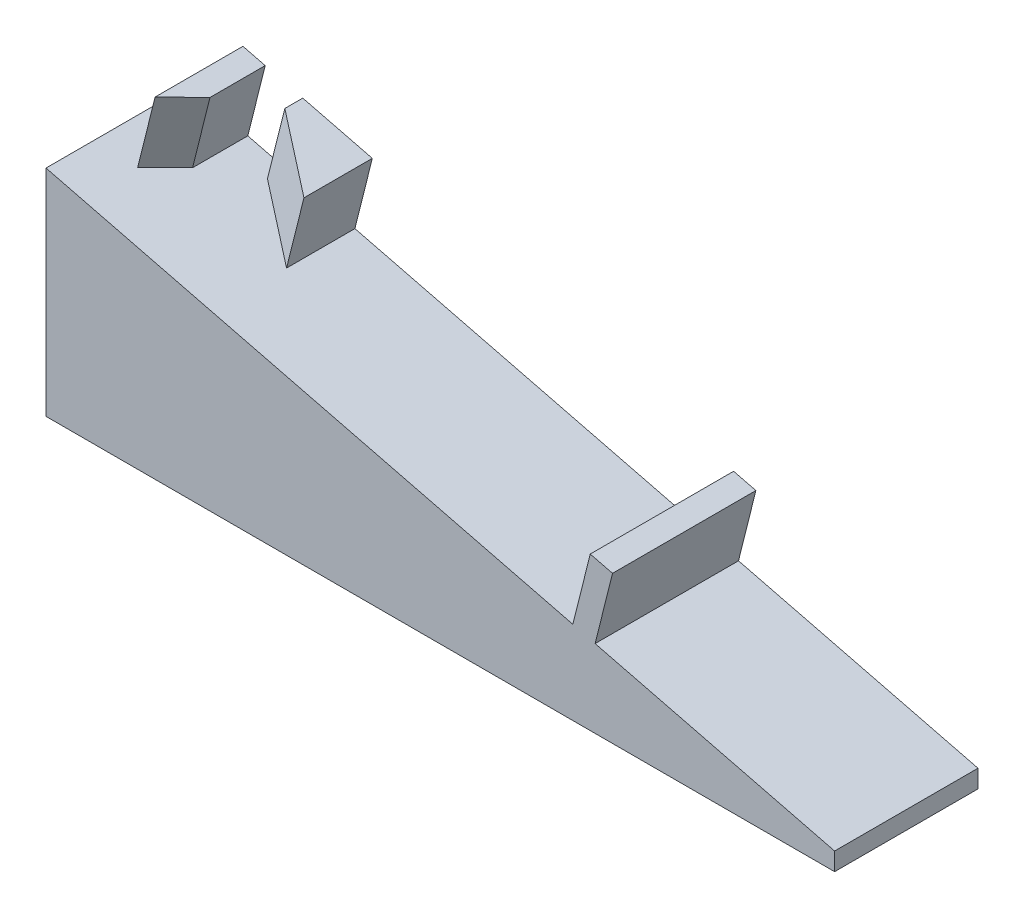
ISO-10303-21;
HEADER;
FILE_DESCRIPTION(('STEP AP214'),'2;1');
FILE_NAME('part.step','',(''),(''),'','','');
FILE_SCHEMA(('AUTOMOTIVE_DESIGN { 1 0 10303 214 1 1 1 1 }'));
ENDSEC;
DATA;
#1=APPLICATION_CONTEXT('core data for automotive mechanical design processes');
#2=APPLICATION_PROTOCOL_DEFINITION('international standard','automotive_design',2000,#1);
#3=PRODUCT_CONTEXT('',#1,'mechanical');
#4=PRODUCT('Part','Part','',(#3));
#5=PRODUCT_RELATED_PRODUCT_CATEGORY('part','',(#4));
#6=PRODUCT_DEFINITION_FORMATION('','',#4);
#7=PRODUCT_DEFINITION_CONTEXT('part definition',#1,'design');
#8=PRODUCT_DEFINITION('design','',#6,#7);
#9=PRODUCT_DEFINITION_SHAPE('','',#8);
#10=(LENGTH_UNIT() NAMED_UNIT(*) SI_UNIT(.MILLI.,.METRE.));
#11=(NAMED_UNIT(*) PLANE_ANGLE_UNIT() SI_UNIT($,.RADIAN.));
#12=(NAMED_UNIT(*) SI_UNIT($,.STERADIAN.) SOLID_ANGLE_UNIT());
#13=UNCERTAINTY_MEASURE_WITH_UNIT(LENGTH_MEASURE(1.E-05),#10,'distance_accuracy_value','');
#14=(GEOMETRIC_REPRESENTATION_CONTEXT(3) GLOBAL_UNCERTAINTY_ASSIGNED_CONTEXT((#13)) GLOBAL_UNIT_ASSIGNED_CONTEXT((#10,
#11,#12)) REPRESENTATION_CONTEXT('',''));
#15=CARTESIAN_POINT('',(0.,0.,0.));
#16=DIRECTION('',(0.,0.,1.));
#17=DIRECTION('',(1.,0.,0.));
#18=AXIS2_PLACEMENT_3D('',#15,#16,#17);
#19=CARTESIAN_POINT('',(-55.,21.875,-10.));
#20=DIRECTION('',(0.242535625036333,0.970142500145332,0.));
#21=DIRECTION('',(-0.970142500145332,0.242535625036333,0.));
#22=AXIS2_PLACEMENT_3D('',#19,#20,#21);
#23=PLANE('',#22);
#24=DIRECTION('',(-0.970142500145332,0.242535625036333,0.));
#25=VECTOR('',#24,1.);
#26=CARTESIAN_POINT('',(-55.,21.875,-10.));
#27=LINE('',#26,#25);
#28=CARTESIAN_POINT('',(55.,-5.62499999999998,-10.));
#29=VERTEX_POINT('',#28);
#30=CARTESIAN_POINT('',(21.5927503864739,2.72681240338153,-10.));
#31=VERTEX_POINT('',#30);
#32=EDGE_CURVE('E341',#29,#31,#27,.T.);
#33=ORIENTED_EDGE('',*,*,#32,.T.);
#34=DIRECTION('',(0.,0.,-1.));
#35=VECTOR('',#34,1.);
#36=CARTESIAN_POINT('',(21.5927503864739,2.72681240338153,-10.));
#37=LINE('',#36,#35);
#38=CARTESIAN_POINT('',(21.5927503864739,2.72681240338153,10.));
#39=VERTEX_POINT('',#38);
#40=EDGE_CURVE('E239',#39,#31,#37,.T.);
#41=ORIENTED_EDGE('',*,*,#40,.F.);
#42=DIRECTION('',(-0.970142500145332,0.242535625036333,0.));
#43=VECTOR('',#42,1.);
#44=CARTESIAN_POINT('',(-55.,21.875,10.));
#45=LINE('',#44,#43);
#46=CARTESIAN_POINT('',(55.,-5.62499999999998,10.));
#47=VERTEX_POINT('',#46);
#48=EDGE_CURVE('E328',#47,#39,#45,.T.);
#49=ORIENTED_EDGE('',*,*,#48,.F.);
#50=DIRECTION('',(0.,0.,1.));
#51=VECTOR('',#50,1.);
#52=CARTESIAN_POINT('',(55.,-5.62499999999998,-10.));
#53=LINE('',#52,#51);
#54=EDGE_CURVE('E352',#29,#47,#53,.T.);
#55=ORIENTED_EDGE('',*,*,#54,.F.);
#56=EDGE_LOOP('',(#33,#41,#49,#55));
#57=FACE_BOUND('',#56,.T.);
#58=ADVANCED_FACE('F33',(#57),#23,.T.);
#59=CARTESIAN_POINT('',(18.4882943860089,3.50292640349779,10.));
#60=VERTEX_POINT('',#59);
#61=CARTESIAN_POINT('',(-55.,21.875,10.));
#62=VERTEX_POINT('',#61);
#63=EDGE_CURVE('E327',#60,#62,#45,.T.);
#64=ORIENTED_EDGE('',*,*,#63,.F.);
#65=DIRECTION('',(0.,0.,1.));
#66=VECTOR('',#65,1.);
#67=CARTESIAN_POINT('',(18.4882943860089,3.50292640349779,-10.));
#68=LINE('',#67,#66);
#69=CARTESIAN_POINT('',(18.4882943860089,3.50292640349779,-10.));
#70=VERTEX_POINT('',#69);
#71=EDGE_CURVE('E246',#70,#60,#68,.T.);
#72=ORIENTED_EDGE('',*,*,#71,.F.);
#73=CARTESIAN_POINT('',(-31.9106084965411,16.1026521241353,-10.));
#74=VERTEX_POINT('',#73);
#75=EDGE_CURVE('E345',#70,#74,#27,.T.);
#76=ORIENTED_EDGE('',*,*,#75,.T.);
#77=DIRECTION('',(0.,0.,-1.));
#78=VECTOR('',#77,1.);
#79=CARTESIAN_POINT('',(-31.9106084965411,16.1026521241353,-0.465101972724636));
#80=LINE('',#79,#78);
#81=CARTESIAN_POINT('',(-31.9106084965411,16.1026521241353,-0.465101972724636));
#82=VERTEX_POINT('',#81);
#83=EDGE_CURVE('E264',#82,#74,#80,.T.);
#84=ORIENTED_EDGE('',*,*,#83,.F.);
#85=DIRECTION('',(0.7934686352783,-0.198367158819575,0.575376394311968));
#86=VECTOR('',#85,1.);
#87=CARTESIAN_POINT('',(-41.6120334979944,18.5280083744986,-7.5));
#88=LINE('',#87,#86);
#89=CARTESIAN_POINT('',(-41.6120334979944,18.5280083744986,-7.5));
#90=VERTEX_POINT('',#89);
#91=EDGE_CURVE('E269',#90,#82,#88,.T.);
#92=ORIENTED_EDGE('',*,*,#91,.F.);
#93=DIRECTION('',(0.,0.,1.));
#94=VECTOR('',#93,1.);
#95=CARTESIAN_POINT('',(-41.6120334979944,18.5280083744986,-10.));
#96=LINE('',#95,#94);
#97=CARTESIAN_POINT('',(-41.6120334979944,18.5280083744986,-10.));
#98=VERTEX_POINT('',#97);
#99=EDGE_CURVE('E278',#98,#90,#96,.T.);
#100=ORIENTED_EDGE('',*,*,#99,.F.);
#101=CARTESIAN_POINT('',(-46.8508029987792,19.8377007496948,-10.));
#102=VERTEX_POINT('',#101);
#103=EDGE_CURVE('E407',#98,#102,#27,.T.);
#104=ORIENTED_EDGE('',*,*,#103,.T.);
#105=DIRECTION('',(0.,0.,-1.));
#106=VECTOR('',#105,1.);
#107=CARTESIAN_POINT('',(-46.8508029987792,19.8377007496948,-10.));
#108=LINE('',#107,#106);
#109=CARTESIAN_POINT('',(-46.8508029987792,19.8377007496948,-2.29875108010538));
#110=VERTEX_POINT('',#109);
#111=EDGE_CURVE('E294',#110,#102,#108,.T.);
#112=ORIENTED_EDGE('',*,*,#111,.F.);
#113=DIRECTION('',(0.558197093702419,-0.139549273425605,-0.817888748466782));
#114=VECTOR('',#113,1.);
#115=CARTESIAN_POINT('',(-49.9552589992443,20.6138147498111,2.25));
#116=LINE('',#115,#114);
#117=CARTESIAN_POINT('',(-49.9552589992443,20.6138147498111,2.25));
#118=VERTEX_POINT('',#117);
#119=EDGE_CURVE('E299',#118,#110,#116,.T.);
#120=ORIENTED_EDGE('',*,*,#119,.F.);
#121=DIRECTION('',(0.,0.,1.));
#122=VECTOR('',#121,1.);
#123=CARTESIAN_POINT('',(-49.9552589992443,20.6138147498111,-10.));
#124=LINE('',#123,#122);
#125=CARTESIAN_POINT('',(-49.9552589992443,20.6138147498111,-10.));
#126=VERTEX_POINT('',#125);
#127=EDGE_CURVE('E308',#126,#118,#124,.T.);
#128=ORIENTED_EDGE('',*,*,#127,.F.);
#129=CARTESIAN_POINT('',(-55.,21.875,-10.));
#130=VERTEX_POINT('',#129);
#131=EDGE_CURVE('E340',#126,#130,#27,.T.);
#132=ORIENTED_EDGE('',*,*,#131,.T.);
#133=DIRECTION('',(0.,0.,1.));
#134=VECTOR('',#133,1.);
#135=CARTESIAN_POINT('',(-55.,21.875,-10.));
#136=LINE('',#135,#134);
#137=EDGE_CURVE('E359',#130,#62,#136,.T.);
#138=ORIENTED_EDGE('',*,*,#137,.T.);
#139=EDGE_LOOP('',(#64,#72,#76,#84,#92,#100,#104,#112,#120,#128,#132,#138));
#140=FACE_BOUND('',#139,.T.);
#141=ADVANCED_FACE('F422',(#140),#23,.T.);
#142=CARTESIAN_POINT('',(55.,-5.62499999999998,-10.));
#143=DIRECTION('',(1.,0.,0.));
#144=DIRECTION('',(0.,0.,-1.));
#145=AXIS2_PLACEMENT_3D('',#142,#143,#144);
#146=PLANE('',#145);
#147=ORIENTED_EDGE('',*,*,#54,.T.);
#148=DIRECTION('',(0.,1.,0.));
#149=VECTOR('',#148,1.);
#150=CARTESIAN_POINT('',(55.,-5.62499999999998,10.));
#151=LINE('',#150,#149);
#152=CARTESIAN_POINT('',(55.,-8.12499999999996,10.));
#153=VERTEX_POINT('',#152);
#154=EDGE_CURVE('E324',#153,#47,#151,.T.);
#155=ORIENTED_EDGE('',*,*,#154,.F.);
#156=DIRECTION('',(0.,0.,1.));
#157=VECTOR('',#156,1.);
#158=CARTESIAN_POINT('',(55.,-8.12499999999996,-10.));
#159=LINE('',#158,#157);
#160=CARTESIAN_POINT('',(55.,-8.12499999999996,-10.));
#161=VERTEX_POINT('',#160);
#162=EDGE_CURVE('E354',#161,#153,#159,.T.);
#163=ORIENTED_EDGE('',*,*,#162,.F.);
#164=DIRECTION('',(0.,1.,0.));
#165=VECTOR('',#164,1.);
#166=CARTESIAN_POINT('',(55.,-5.62499999999998,-10.));
#167=LINE('',#166,#165);
#168=EDGE_CURVE('E337',#161,#29,#167,.T.);
#169=ORIENTED_EDGE('',*,*,#168,.T.);
#170=EDGE_LOOP('',(#147,#155,#163,#169));
#171=FACE_BOUND('',#170,.T.);
#172=ADVANCED_FACE('F35',(#171),#146,.T.);
#173=CARTESIAN_POINT('',(-55.,-8.125,-10.));
#174=DIRECTION('',(0.,-1.,0.));
#175=DIRECTION('',(1.,0.,0.));
#176=AXIS2_PLACEMENT_3D('',#173,#174,#175);
#177=PLANE('',#176);
#178=DIRECTION('',(0.292714272094112,0.,-0.956199955507432));
#179=VECTOR('',#178,1.);
#180=CARTESIAN_POINT('',(15.6920933422319,-8.12500000000012,-10.0585428544188));
#181=LINE('',#180,#179);
#182=CARTESIAN_POINT('',(14.112947570471,-8.12500000000004,-4.90000000000001));
#183=VERTEX_POINT('',#182);
#184=CARTESIAN_POINT('',(15.6741720602669,-8.12500000000012,-10.));
#185=VERTEX_POINT('',#184);
#186=EDGE_CURVE('E203',#183,#185,#181,.T.);
#187=ORIENTED_EDGE('',*,*,#186,.F.);
#188=DIRECTION('',(-1.,0.,0.));
#189=VECTOR('',#188,1.);
#190=CARTESIAN_POINT('',(14.112947570471,-8.12500000000004,-4.90000000000001));
#191=LINE('',#190,#189);
#192=CARTESIAN_POINT('',(22.5537190961957,-8.12500000000004,-4.90000000000001));
#193=VERTEX_POINT('',#192);
#194=EDGE_CURVE('E220',#193,#183,#191,.T.);
#195=ORIENTED_EDGE('',*,*,#194,.F.);
#196=DIRECTION('',(0.292714272094112,0.,0.956199955507432));
#197=VECTOR('',#196,1.);
#198=CARTESIAN_POINT('',(22.5537190961957,-8.12500000000004,-4.90000000000001));
#199=LINE('',#198,#197);
#200=CARTESIAN_POINT('',(20.9924946063998,-8.12500000000011,-10.));
#201=VERTEX_POINT('',#200);
#202=EDGE_CURVE('E209',#201,#193,#199,.T.);
#203=ORIENTED_EDGE('',*,*,#202,.F.);
#204=DIRECTION('',(1.,0.,0.));
#205=VECTOR('',#204,1.);
#206=CARTESIAN_POINT('',(-55.,-8.125,-10.));
#207=LINE('',#206,#205);
#208=EDGE_CURVE('E348',#201,#161,#207,.T.);
#209=ORIENTED_EDGE('',*,*,#208,.T.);
#210=ORIENTED_EDGE('',*,*,#162,.T.);
#211=DIRECTION('',(1.,0.,0.));
#212=VECTOR('',#211,1.);
#213=CARTESIAN_POINT('',(-55.,-8.125,10.));
#214=LINE('',#213,#212);
#215=CARTESIAN_POINT('',(-55.,-8.125,10.));
#216=VERTEX_POINT('',#215);
#217=EDGE_CURVE('E334',#216,#153,#214,.T.);
#218=ORIENTED_EDGE('',*,*,#217,.F.);
#219=DIRECTION('',(0.,0.,1.));
#220=VECTOR('',#219,1.);
#221=CARTESIAN_POINT('',(-55.,-8.125,-10.));
#222=LINE('',#221,#220);
#223=CARTESIAN_POINT('',(-55.,-8.125,-10.));
#224=VERTEX_POINT('',#223);
#225=EDGE_CURVE('E357',#224,#216,#222,.T.);
#226=ORIENTED_EDGE('',*,*,#225,.F.);
#227=CARTESIAN_POINT('',(-20.9924946063997,-8.12500000000012,-10.));
#228=VERTEX_POINT('',#227);
#229=EDGE_CURVE('E349',#224,#228,#207,.T.);
#230=ORIENTED_EDGE('',*,*,#229,.T.);
#231=DIRECTION('',(0.292714272094112,0.,-0.956199955507432));
#232=VECTOR('',#231,1.);
#233=CARTESIAN_POINT('',(-20.9745733244348,-8.12500000000013,-10.0585428544188));
#234=LINE('',#233,#232);
#235=CARTESIAN_POINT('',(-22.5537190961957,-8.12500000000006,-4.90000000000001));
#236=VERTEX_POINT('',#235);
#237=EDGE_CURVE('E228',#236,#228,#234,.T.);
#238=ORIENTED_EDGE('',*,*,#237,.F.);
#239=DIRECTION('',(-1.,0.,0.));
#240=VECTOR('',#239,1.);
#241=CARTESIAN_POINT('',(-22.5537190961957,-8.12500000000006,-4.90000000000001));
#242=LINE('',#241,#240);
#243=CARTESIAN_POINT('',(-14.112947570471,-8.12500000000005,-4.90000000000001));
#244=VERTEX_POINT('',#243);
#245=EDGE_CURVE('E233',#244,#236,#242,.T.);
#246=ORIENTED_EDGE('',*,*,#245,.F.);
#247=DIRECTION('',(0.292714272094112,0.,0.956199955507432));
#248=VECTOR('',#247,1.);
#249=CARTESIAN_POINT('',(-14.112947570471,-8.12500000000005,-4.90000000000001));
#250=LINE('',#249,#248);
#251=CARTESIAN_POINT('',(-15.6741720602669,-8.12500000000012,-10.));
#252=VERTEX_POINT('',#251);
#253=EDGE_CURVE('E223',#252,#244,#250,.T.);
#254=ORIENTED_EDGE('',*,*,#253,.F.);
#255=EDGE_CURVE('E353',#252,#185,#207,.T.);
#256=ORIENTED_EDGE('',*,*,#255,.T.);
#257=EDGE_LOOP('',(#187,#195,#203,#209,#210,#218,#226,#230,#238,#246,#254,#256));
#258=FACE_BOUND('',#257,.T.);
#259=ADVANCED_FACE('F377',(#258),#177,.T.);
#260=CARTESIAN_POINT('',(-55.,21.875,-10.));
#261=DIRECTION('',(-1.,0.,0.));
#262=DIRECTION('',(0.,-1.,0.));
#263=AXIS2_PLACEMENT_3D('',#260,#261,#262);
#264=PLANE('',#263);
#265=ORIENTED_EDGE('',*,*,#225,.T.);
#266=DIRECTION('',(0.,-1.,0.));
#267=VECTOR('',#266,1.);
#268=CARTESIAN_POINT('',(-55.,21.875,10.));
#269=LINE('',#268,#267);
#270=EDGE_CURVE('E331',#62,#216,#269,.T.);
#271=ORIENTED_EDGE('',*,*,#270,.F.);
#272=ORIENTED_EDGE('',*,*,#137,.F.);
#273=DIRECTION('',(0.,-1.,0.));
#274=VECTOR('',#273,1.);
#275=CARTESIAN_POINT('',(-55.,21.875,-10.));
#276=LINE('',#275,#274);
#277=EDGE_CURVE('E344',#130,#224,#276,.T.);
#278=ORIENTED_EDGE('',*,*,#277,.T.);
#279=EDGE_LOOP('',(#265,#271,#272,#278));
#280=FACE_BOUND('',#279,.T.);
#281=ADVANCED_FACE('F402',(#280),#264,.T.);
#282=CARTESIAN_POINT('',(0.,0.,-10.));
#283=DIRECTION('',(0.,0.,1.));
#284=DIRECTION('',(1.,0.,0.));
#285=AXIS2_PLACEMENT_3D('',#282,#283,#284);
#286=PLANE('',#285);
#287=DIRECTION('',(-1.,0.,0.));
#288=VECTOR('',#287,1.);
#289=CARTESIAN_POINT('',(0.,-2.92500000000012,-10.));
#290=LINE('',#289,#288);
#291=CARTESIAN_POINT('',(20.9924946063998,-2.92500000000011,-10.));
#292=VERTEX_POINT('',#291);
#293=CARTESIAN_POINT('',(15.6741720602669,-2.92500000000011,-10.));
#294=VERTEX_POINT('',#293);
#295=EDGE_CURVE('E200',#292,#294,#290,.T.);
#296=ORIENTED_EDGE('',*,*,#295,.T.);
#297=DIRECTION('',(0.,-1.,0.));
#298=VECTOR('',#297,1.);
#299=CARTESIAN_POINT('',(15.6741720602669,0.,-10.));
#300=LINE('',#299,#298);
#301=EDGE_CURVE('E11',#294,#185,#300,.T.);
#302=ORIENTED_EDGE('',*,*,#301,.T.);
#303=ORIENTED_EDGE('',*,*,#255,.F.);
#304=DIRECTION('',(0.,1.,0.));
#305=VECTOR('',#304,1.);
#306=CARTESIAN_POINT('',(-15.6741720602669,0.,-10.));
#307=LINE('',#306,#305);
#308=CARTESIAN_POINT('',(-15.6741720602669,-2.92500000000012,-10.));
#309=VERTEX_POINT('',#308);
#310=EDGE_CURVE('E365',#252,#309,#307,.T.);
#311=ORIENTED_EDGE('',*,*,#310,.T.);
#312=DIRECTION('',(-1.,0.,0.));
#313=VECTOR('',#312,1.);
#314=CARTESIAN_POINT('',(0.,-2.92500000000012,-10.));
#315=LINE('',#314,#313);
#316=CARTESIAN_POINT('',(-20.9924946063997,-2.92500000000013,-10.));
#317=VERTEX_POINT('',#316);
#318=EDGE_CURVE('E356',#309,#317,#315,.T.);
#319=ORIENTED_EDGE('',*,*,#318,.T.);
#320=DIRECTION('',(0.,-1.,0.));
#321=VECTOR('',#320,1.);
#322=CARTESIAN_POINT('',(-20.9924946063997,0.,-10.));
#323=LINE('',#322,#321);
#324=EDGE_CURVE('E368',#317,#228,#323,.T.);
#325=ORIENTED_EDGE('',*,*,#324,.T.);
#326=ORIENTED_EDGE('',*,*,#229,.F.);
#327=ORIENTED_EDGE('',*,*,#277,.F.);
#328=ORIENTED_EDGE('',*,*,#131,.F.);
#329=DIRECTION('',(-0.242535625036333,-0.970142500145332,0.));
#330=VECTOR('',#329,1.);
#331=CARTESIAN_POINT('',(-47.529902748881,30.3152397512644,-10.));
#332=LINE('',#331,#330);
#333=CARTESIAN_POINT('',(-47.529902748881,30.3152397512644,-10.));
#334=VERTEX_POINT('',#333);
#335=EDGE_CURVE('E318',#334,#126,#332,.T.);
#336=ORIENTED_EDGE('',*,*,#335,.F.);
#337=DIRECTION('',(-0.970142500145332,0.242535625036333,0.));
#338=VECTOR('',#337,1.);
#339=CARTESIAN_POINT('',(-47.529902748881,30.3152397512644,-10.));
#340=LINE('',#339,#338);
#341=CARTESIAN_POINT('',(-44.4254467484159,29.5391257511481,-10.));
#342=VERTEX_POINT('',#341);
#343=EDGE_CURVE('E298',#342,#334,#340,.T.);
#344=ORIENTED_EDGE('',*,*,#343,.F.);
#345=DIRECTION('',(-0.242535625036333,-0.970142500145332,0.));
#346=VECTOR('',#345,1.);
#347=CARTESIAN_POINT('',(-44.4254467484159,29.5391257511481,-10.));
#348=LINE('',#347,#346);
#349=EDGE_CURVE('E321',#342,#102,#348,.T.);
#350=ORIENTED_EDGE('',*,*,#349,.T.);
#351=ORIENTED_EDGE('',*,*,#103,.F.);
#352=DIRECTION('',(-0.242535625036333,-0.970142500145332,0.));
#353=VECTOR('',#352,1.);
#354=CARTESIAN_POINT('',(-39.1866772476311,28.2294333759519,-10.));
#355=LINE('',#354,#353);
#356=CARTESIAN_POINT('',(-39.1866772476311,28.2294333759519,-10.));
#357=VERTEX_POINT('',#356);
#358=EDGE_CURVE('E288',#357,#98,#355,.T.);
#359=ORIENTED_EDGE('',*,*,#358,.F.);
#360=DIRECTION('',(-0.970142500145332,0.242535625036333,0.));
#361=VECTOR('',#360,1.);
#362=CARTESIAN_POINT('',(-29.4852522461778,25.8040771255886,-10.));
#363=LINE('',#362,#361);
#364=CARTESIAN_POINT('',(-29.4852522461778,25.8040771255886,-10.));
#365=VERTEX_POINT('',#364);
#366=EDGE_CURVE('E268',#365,#357,#363,.T.);
#367=ORIENTED_EDGE('',*,*,#366,.F.);
#368=DIRECTION('',(-0.242535625036333,-0.970142500145332,0.));
#369=VECTOR('',#368,1.);
#370=CARTESIAN_POINT('',(-29.4852522461778,25.8040771255886,-10.));
#371=LINE('',#370,#369);
#372=EDGE_CURVE('E291',#365,#74,#371,.T.);
#373=ORIENTED_EDGE('',*,*,#372,.T.);
#374=ORIENTED_EDGE('',*,*,#75,.F.);
#375=DIRECTION('',(-0.242535625036333,-0.970142500145332,0.));
#376=VECTOR('',#375,1.);
#377=CARTESIAN_POINT('',(20.9136506363722,13.2043514049511,-10.));
#378=LINE('',#377,#376);
#379=CARTESIAN_POINT('',(20.9136506363722,13.2043514049511,-10.));
#380=VERTEX_POINT('',#379);
#381=EDGE_CURVE('E260',#380,#70,#378,.T.);
#382=ORIENTED_EDGE('',*,*,#381,.F.);
#383=DIRECTION('',(-0.970142500145332,0.242535625036333,0.));
#384=VECTOR('',#383,1.);
#385=CARTESIAN_POINT('',(24.0181066368373,12.4282374048348,-10.));
#386=LINE('',#385,#384);
#387=CARTESIAN_POINT('',(24.0181066368373,12.4282374048348,-10.));
#388=VERTEX_POINT('',#387);
#389=EDGE_CURVE('E245',#388,#380,#386,.T.);
#390=ORIENTED_EDGE('',*,*,#389,.F.);
#391=DIRECTION('',(-0.242535625036333,-0.970142500145332,0.));
#392=VECTOR('',#391,1.);
#393=CARTESIAN_POINT('',(24.0181066368373,12.4282374048348,-10.));
#394=LINE('',#393,#392);
#395=EDGE_CURVE('E262',#388,#31,#394,.T.);
#396=ORIENTED_EDGE('',*,*,#395,.T.);
#397=ORIENTED_EDGE('',*,*,#32,.F.);
#398=ORIENTED_EDGE('',*,*,#168,.F.);
#399=ORIENTED_EDGE('',*,*,#208,.F.);
#400=DIRECTION('',(0.,1.,0.));
#401=VECTOR('',#400,1.);
#402=CARTESIAN_POINT('',(20.9924946063998,0.,-10.));
#403=LINE('',#402,#401);
#404=EDGE_CURVE('E41',#201,#292,#403,.T.);
#405=ORIENTED_EDGE('',*,*,#404,.T.);
#406=EDGE_LOOP('',(#296,#302,#303,#311,#319,#325,#326,#327,#328,#336,#344,#350,#351,#359,#367,
#373,#374,#382,#390,#396,#397,#398,#399,#405));
#407=FACE_BOUND('',#406,.T.);
#408=ADVANCED_FACE('F373',(#407),#286,.F.);
#409=CARTESIAN_POINT('',(0.,0.,10.));
#410=DIRECTION('',(0.,0.,1.));
#411=DIRECTION('',(1.,0.,0.));
#412=AXIS2_PLACEMENT_3D('',#409,#410,#411);
#413=PLANE('',#412);
#414=ORIENTED_EDGE('',*,*,#154,.T.);
#415=ORIENTED_EDGE('',*,*,#48,.T.);
#416=DIRECTION('',(-0.242535625036333,-0.970142500145332,0.));
#417=VECTOR('',#416,1.);
#418=CARTESIAN_POINT('',(24.0181066368373,12.4282374048348,10.));
#419=LINE('',#418,#417);
#420=CARTESIAN_POINT('',(24.0181066368373,12.4282374048348,10.));
#421=VERTEX_POINT('',#420);
#422=EDGE_CURVE('E252',#421,#39,#419,.T.);
#423=ORIENTED_EDGE('',*,*,#422,.F.);
#424=DIRECTION('',(0.970142500145332,-0.242535625036333,0.));
#425=VECTOR('',#424,1.);
#426=CARTESIAN_POINT('',(24.0181066368373,12.4282374048348,10.));
#427=LINE('',#426,#425);
#428=CARTESIAN_POINT('',(20.9136506363722,13.2043514049511,10.));
#429=VERTEX_POINT('',#428);
#430=EDGE_CURVE('E250',#429,#421,#427,.T.);
#431=ORIENTED_EDGE('',*,*,#430,.F.);
#432=DIRECTION('',(-0.242535625036333,-0.970142500145332,0.));
#433=VECTOR('',#432,1.);
#434=CARTESIAN_POINT('',(20.9136506363722,13.2043514049511,10.));
#435=LINE('',#434,#433);
#436=EDGE_CURVE('E258',#429,#60,#435,.T.);
#437=ORIENTED_EDGE('',*,*,#436,.T.);
#438=ORIENTED_EDGE('',*,*,#63,.T.);
#439=ORIENTED_EDGE('',*,*,#270,.T.);
#440=ORIENTED_EDGE('',*,*,#217,.T.);
#441=EDGE_LOOP('',(#414,#415,#423,#431,#437,#438,#439,#440));
#442=FACE_BOUND('',#441,.T.);
#443=ADVANCED_FACE('F446',(#442),#413,.T.);
#444=CARTESIAN_POINT('',(-44.4254467484159,29.5391257511481,-10.));
#445=DIRECTION('',(-0.970142500145332,0.242535625036333,0.));
#446=DIRECTION('',(-0.242535625036333,-0.970142500145332,0.));
#447=AXIS2_PLACEMENT_3D('',#444,#445,#446);
#448=PLANE('',#447);
#449=ORIENTED_EDGE('',*,*,#111,.T.);
#450=ORIENTED_EDGE('',*,*,#349,.F.);
#451=DIRECTION('',(0.,0.,-1.));
#452=VECTOR('',#451,1.);
#453=CARTESIAN_POINT('',(-44.4254467484159,29.5391257511481,-10.));
#454=LINE('',#453,#452);
#455=CARTESIAN_POINT('',(-44.4254467484159,29.5391257511481,-2.29875108010538));
#456=VERTEX_POINT('',#455);
#457=EDGE_CURVE('E295',#456,#342,#454,.T.);
#458=ORIENTED_EDGE('',*,*,#457,.F.);
#459=DIRECTION('',(-0.242535625036333,-0.970142500145332,0.));
#460=VECTOR('',#459,1.);
#461=CARTESIAN_POINT('',(-44.4254467484159,29.5391257511481,-2.29875108010538));
#462=LINE('',#461,#460);
#463=EDGE_CURVE('E305',#456,#110,#462,.T.);
#464=ORIENTED_EDGE('',*,*,#463,.T.);
#465=EDGE_LOOP('',(#449,#450,#458,#464));
#466=FACE_BOUND('',#465,.T.);
#467=ADVANCED_FACE('F420',(#466),#448,.F.);
#468=CARTESIAN_POINT('',(-47.529902748881,30.3152397512644,-10.));
#469=DIRECTION('',(0.970142500145332,-0.242535625036333,0.));
#470=DIRECTION('',(0.242535625036333,0.970142500145332,0.));
#471=AXIS2_PLACEMENT_3D('',#468,#469,#470);
#472=PLANE('',#471);
#473=ORIENTED_EDGE('',*,*,#127,.T.);
#474=DIRECTION('',(-0.242535625036333,-0.970142500145332,0.));
#475=VECTOR('',#474,1.);
#476=CARTESIAN_POINT('',(-47.529902748881,30.3152397512644,2.25));
#477=LINE('',#476,#475);
#478=CARTESIAN_POINT('',(-47.529902748881,30.3152397512644,2.25));
#479=VERTEX_POINT('',#478);
#480=EDGE_CURVE('E315',#479,#118,#477,.T.);
#481=ORIENTED_EDGE('',*,*,#480,.F.);
#482=DIRECTION('',(0.,0.,1.));
#483=VECTOR('',#482,1.);
#484=CARTESIAN_POINT('',(-47.529902748881,30.3152397512644,-10.));
#485=LINE('',#484,#483);
#486=EDGE_CURVE('E301',#334,#479,#485,.T.);
#487=ORIENTED_EDGE('',*,*,#486,.F.);
#488=ORIENTED_EDGE('',*,*,#335,.T.);
#489=EDGE_LOOP('',(#473,#481,#487,#488));
#490=FACE_BOUND('',#489,.T.);
#491=ADVANCED_FACE('F409',(#490),#472,.F.);
#492=CARTESIAN_POINT('',(-47.529902748881,30.3152397512644,2.25));
#493=DIRECTION('',(-0.7934686352783,0.198367158819575,-0.575376394311968));
#494=DIRECTION('',(-0.587042225007092,0.,0.809556314322063));
#495=AXIS2_PLACEMENT_3D('',#492,#493,#494);
#496=PLANE('',#495);
#497=ORIENTED_EDGE('',*,*,#119,.T.);
#498=ORIENTED_EDGE('',*,*,#463,.F.);
#499=DIRECTION('',(0.558197093702419,-0.139549273425605,-0.817888748466782));
#500=VECTOR('',#499,1.);
#501=CARTESIAN_POINT('',(-47.529902748881,30.3152397512644,2.25));
#502=LINE('',#501,#500);
#503=EDGE_CURVE('E303',#479,#456,#502,.T.);
#504=ORIENTED_EDGE('',*,*,#503,.F.);
#505=ORIENTED_EDGE('',*,*,#480,.T.);
#506=EDGE_LOOP('',(#497,#498,#504,#505));
#507=FACE_BOUND('',#506,.T.);
#508=ADVANCED_FACE('F424',(#507),#496,.F.);
#509=CARTESIAN_POINT('',(4.33712095624568,17.3484838249827,0.));
#510=DIRECTION('',(0.242535625036333,0.970142500145332,0.));
#511=DIRECTION('',(-0.970142500145332,0.242535625036333,0.));
#512=AXIS2_PLACEMENT_3D('',#509,#510,#511);
#513=PLANE('',#512);
#514=ORIENTED_EDGE('',*,*,#457,.T.);
#515=ORIENTED_EDGE('',*,*,#343,.T.);
#516=ORIENTED_EDGE('',*,*,#486,.T.);
#517=ORIENTED_EDGE('',*,*,#503,.T.);
#518=EDGE_LOOP('',(#514,#515,#516,#517));
#519=FACE_BOUND('',#518,.T.);
#520=ADVANCED_FACE('F413',(#519),#513,.T.);
#521=CARTESIAN_POINT('',(-29.4852522461778,25.8040771255886,-0.465101972724636));
#522=DIRECTION('',(-0.970142500145332,0.242535625036333,0.));
#523=DIRECTION('',(-0.242535625036333,-0.970142500145332,0.));
#524=AXIS2_PLACEMENT_3D('',#521,#522,#523);
#525=PLANE('',#524);
#526=ORIENTED_EDGE('',*,*,#83,.T.);
#527=ORIENTED_EDGE('',*,*,#372,.F.);
#528=DIRECTION('',(0.,0.,-1.));
#529=VECTOR('',#528,1.);
#530=CARTESIAN_POINT('',(-29.4852522461778,25.8040771255886,-0.465101972724636));
#531=LINE('',#530,#529);
#532=CARTESIAN_POINT('',(-29.4852522461778,25.8040771255886,-0.465101972724636));
#533=VERTEX_POINT('',#532);
#534=EDGE_CURVE('E265',#533,#365,#531,.T.);
#535=ORIENTED_EDGE('',*,*,#534,.F.);
#536=DIRECTION('',(-0.242535625036333,-0.970142500145332,0.));
#537=VECTOR('',#536,1.);
#538=CARTESIAN_POINT('',(-29.4852522461778,25.8040771255886,-0.465101972724636));
#539=LINE('',#538,#537);
#540=EDGE_CURVE('E275',#533,#82,#539,.T.);
#541=ORIENTED_EDGE('',*,*,#540,.T.);
#542=EDGE_LOOP('',(#526,#527,#535,#541));
#543=FACE_BOUND('',#542,.T.);
#544=ADVANCED_FACE('F431',(#543),#525,.F.);
#545=CARTESIAN_POINT('',(-39.1866772476311,28.2294333759519,-10.));
#546=DIRECTION('',(0.970142500145332,-0.242535625036333,0.));
#547=DIRECTION('',(0.242535625036333,0.970142500145332,0.));
#548=AXIS2_PLACEMENT_3D('',#545,#546,#547);
#549=PLANE('',#548);
#550=ORIENTED_EDGE('',*,*,#99,.T.);
#551=DIRECTION('',(-0.242535625036333,-0.970142500145332,0.));
#552=VECTOR('',#551,1.);
#553=CARTESIAN_POINT('',(-39.1866772476311,28.2294333759519,-7.5));
#554=LINE('',#553,#552);
#555=CARTESIAN_POINT('',(-39.1866772476311,28.2294333759519,-7.5));
#556=VERTEX_POINT('',#555);
#557=EDGE_CURVE('E285',#556,#90,#554,.T.);
#558=ORIENTED_EDGE('',*,*,#557,.F.);
#559=DIRECTION('',(0.,0.,1.));
#560=VECTOR('',#559,1.);
#561=CARTESIAN_POINT('',(-39.1866772476311,28.2294333759519,-10.));
#562=LINE('',#561,#560);
#563=EDGE_CURVE('E271',#357,#556,#562,.T.);
#564=ORIENTED_EDGE('',*,*,#563,.F.);
#565=ORIENTED_EDGE('',*,*,#358,.T.);
#566=EDGE_LOOP('',(#550,#558,#564,#565));
#567=FACE_BOUND('',#566,.T.);
#568=ADVANCED_FACE('F478',(#567),#549,.F.);
#569=CARTESIAN_POINT('',(-39.1866772476311,28.2294333759519,-7.5));
#570=DIRECTION('',(0.558197093702419,-0.139549273425605,-0.817888748466782));
#571=DIRECTION('',(-0.8259707664561,0.,-0.563712952627419));
#572=AXIS2_PLACEMENT_3D('',#569,#570,#571);
#573=PLANE('',#572);
#574=ORIENTED_EDGE('',*,*,#91,.T.);
#575=ORIENTED_EDGE('',*,*,#540,.F.);
#576=DIRECTION('',(0.7934686352783,-0.198367158819575,0.575376394311968));
#577=VECTOR('',#576,1.);
#578=CARTESIAN_POINT('',(-39.1866772476311,28.2294333759519,-7.5));
#579=LINE('',#578,#577);
#580=EDGE_CURVE('E273',#556,#533,#579,.T.);
#581=ORIENTED_EDGE('',*,*,#580,.F.);
#582=ORIENTED_EDGE('',*,*,#557,.T.);
#583=EDGE_LOOP('',(#574,#575,#581,#582));
#584=FACE_BOUND('',#583,.T.);
#585=ADVANCED_FACE('F488',(#584),#573,.F.);
#586=CARTESIAN_POINT('',(4.33712095624568,17.3484838249827,0.));
#587=DIRECTION('',(0.242535625036333,0.970142500145332,0.));
#588=DIRECTION('',(-0.970142500145332,0.242535625036333,0.));
#589=AXIS2_PLACEMENT_3D('',#586,#587,#588);
#590=PLANE('',#589);
#591=ORIENTED_EDGE('',*,*,#534,.T.);
#592=ORIENTED_EDGE('',*,*,#366,.T.);
#593=ORIENTED_EDGE('',*,*,#563,.T.);
#594=ORIENTED_EDGE('',*,*,#580,.T.);
#595=EDGE_LOOP('',(#591,#592,#593,#594));
#596=FACE_BOUND('',#595,.T.);
#597=ADVANCED_FACE('F498',(#596),#590,.T.);
#598=CARTESIAN_POINT('',(24.0181066368373,12.4282374048348,-10.));
#599=DIRECTION('',(-0.970142500145332,0.242535625036333,0.));
#600=DIRECTION('',(-0.242535625036333,-0.970142500145332,0.));
#601=AXIS2_PLACEMENT_3D('',#598,#599,#600);
#602=PLANE('',#601);
#603=ORIENTED_EDGE('',*,*,#40,.T.);
#604=ORIENTED_EDGE('',*,*,#395,.F.);
#605=DIRECTION('',(0.,0.,-1.));
#606=VECTOR('',#605,1.);
#607=CARTESIAN_POINT('',(24.0181066368373,12.4282374048348,-10.));
#608=LINE('',#607,#606);
#609=EDGE_CURVE('E242',#421,#388,#608,.T.);
#610=ORIENTED_EDGE('',*,*,#609,.F.);
#611=ORIENTED_EDGE('',*,*,#422,.T.);
#612=EDGE_LOOP('',(#603,#604,#610,#611));
#613=FACE_BOUND('',#612,.T.);
#614=ADVANCED_FACE('F508',(#613),#602,.F.);
#615=CARTESIAN_POINT('',(20.9136506363722,13.2043514049511,-10.));
#616=DIRECTION('',(0.970142500145332,-0.242535625036333,0.));
#617=DIRECTION('',(0.242535625036333,0.970142500145332,0.));
#618=AXIS2_PLACEMENT_3D('',#615,#616,#617);
#619=PLANE('',#618);
#620=ORIENTED_EDGE('',*,*,#71,.T.);
#621=ORIENTED_EDGE('',*,*,#436,.F.);
#622=DIRECTION('',(0.,0.,1.));
#623=VECTOR('',#622,1.);
#624=CARTESIAN_POINT('',(20.9136506363722,13.2043514049511,-10.));
#625=LINE('',#624,#623);
#626=EDGE_CURVE('E248',#380,#429,#625,.T.);
#627=ORIENTED_EDGE('',*,*,#626,.F.);
#628=ORIENTED_EDGE('',*,*,#381,.T.);
#629=EDGE_LOOP('',(#620,#621,#627,#628));
#630=FACE_BOUND('',#629,.T.);
#631=ADVANCED_FACE('F518',(#630),#619,.F.);
#632=CARTESIAN_POINT('',(4.33712095624569,17.3484838249827,0.));
#633=DIRECTION('',(-0.242535625036333,-0.970142500145332,0.));
#634=DIRECTION('',(0.970142500145332,-0.242535625036333,0.));
#635=AXIS2_PLACEMENT_3D('',#632,#633,#634);
#636=PLANE('',#635);
#637=ORIENTED_EDGE('',*,*,#609,.T.);
#638=ORIENTED_EDGE('',*,*,#389,.T.);
#639=ORIENTED_EDGE('',*,*,#626,.T.);
#640=ORIENTED_EDGE('',*,*,#430,.T.);
#641=EDGE_LOOP('',(#637,#638,#639,#640));
#642=FACE_BOUND('',#641,.T.);
#643=ADVANCED_FACE('F528',(#642),#636,.F.);
#644=CARTESIAN_POINT('',(-20.9745733244348,-2.92500000000013,-10.0585428544188));
#645=DIRECTION('',(-0.956199955507432,0.,-0.292714272094112));
#646=DIRECTION('',(-0.292714272094112,0.,0.956199955507432));
#647=AXIS2_PLACEMENT_3D('',#644,#645,#646);
#648=PLANE('',#647);
#649=DIRECTION('',(0.292714272094112,0.,-0.956199955507432));
#650=VECTOR('',#649,1.);
#651=CARTESIAN_POINT('',(-20.9745733244348,-2.92500000000013,-10.0585428544188));
#652=LINE('',#651,#650);
#653=CARTESIAN_POINT('',(-22.5537190961957,-2.92500000000006,-4.90000000000001));
#654=VERTEX_POINT('',#653);
#655=EDGE_CURVE('E56',#654,#317,#652,.T.);
#656=ORIENTED_EDGE('',*,*,#655,.F.);
#657=DIRECTION('',(0.,-1.,0.));
#658=VECTOR('',#657,1.);
#659=CARTESIAN_POINT('',(-22.5537190961957,-2.92500000000006,-4.90000000000001));
#660=LINE('',#659,#658);
#661=EDGE_CURVE('E237',#654,#236,#660,.T.);
#662=ORIENTED_EDGE('',*,*,#661,.T.);
#663=ORIENTED_EDGE('',*,*,#237,.T.);
#664=ORIENTED_EDGE('',*,*,#324,.F.);
#665=EDGE_LOOP('',(#656,#662,#663,#664));
#666=FACE_BOUND('',#665,.T.);
#667=ADVANCED_FACE('F395',(#666),#648,.F.);
#668=CARTESIAN_POINT('',(-14.112947570471,-2.92500000000005,-4.90000000000001));
#669=DIRECTION('',(0.956199955507432,0.,-0.292714272094112));
#670=DIRECTION('',(-0.292714272094112,0.,-0.956199955507432));
#671=AXIS2_PLACEMENT_3D('',#668,#669,#670);
#672=PLANE('',#671);
#673=ORIENTED_EDGE('',*,*,#253,.T.);
#674=DIRECTION('',(0.,-1.,0.));
#675=VECTOR('',#674,1.);
#676=CARTESIAN_POINT('',(-14.112947570471,-2.92500000000005,-4.90000000000001));
#677=LINE('',#676,#675);
#678=CARTESIAN_POINT('',(-14.112947570471,-2.92500000000005,-4.90000000000001));
#679=VERTEX_POINT('',#678);
#680=EDGE_CURVE('E231',#679,#244,#677,.T.);
#681=ORIENTED_EDGE('',*,*,#680,.F.);
#682=DIRECTION('',(0.292714272094112,0.,0.956199955507432));
#683=VECTOR('',#682,1.);
#684=CARTESIAN_POINT('',(-14.112947570471,-2.92500000000005,-4.90000000000001));
#685=LINE('',#684,#683);
#686=EDGE_CURVE('E225',#309,#679,#685,.T.);
#687=ORIENTED_EDGE('',*,*,#686,.F.);
#688=ORIENTED_EDGE('',*,*,#310,.F.);
#689=EDGE_LOOP('',(#673,#681,#687,#688));
#690=FACE_BOUND('',#689,.T.);
#691=ADVANCED_FACE('F386',(#690),#672,.F.);
#692=CARTESIAN_POINT('',(0.,-2.92499999999998,1.12840626848805E-13));
#693=DIRECTION('',(0.,1.,0.));
#694=DIRECTION('',(0.,0.,1.));
#695=AXIS2_PLACEMENT_3D('',#692,#693,#694);
#696=PLANE('',#695);
#697=ORIENTED_EDGE('',*,*,#686,.T.);
#698=DIRECTION('',(-1.,0.,0.));
#699=VECTOR('',#698,1.);
#700=CARTESIAN_POINT('',(-22.5537190961957,-2.92500000000006,-4.90000000000001));
#701=LINE('',#700,#699);
#702=EDGE_CURVE('E227',#679,#654,#701,.T.);
#703=ORIENTED_EDGE('',*,*,#702,.T.);
#704=ORIENTED_EDGE('',*,*,#655,.T.);
#705=ORIENTED_EDGE('',*,*,#318,.F.);
#706=EDGE_LOOP('',(#697,#703,#704,#705));
#707=FACE_BOUND('',#706,.T.);
#708=ADVANCED_FACE('F393',(#707),#696,.F.);
#709=CARTESIAN_POINT('',(-22.5537190961957,-2.92500000000006,-4.90000000000001));
#710=DIRECTION('',(0.,0.,1.));
#711=DIRECTION('',(1.,0.,0.));
#712=AXIS2_PLACEMENT_3D('',#709,#710,#711);
#713=PLANE('',#712);
#714=ORIENTED_EDGE('',*,*,#245,.T.);
#715=ORIENTED_EDGE('',*,*,#661,.F.);
#716=ORIENTED_EDGE('',*,*,#702,.F.);
#717=ORIENTED_EDGE('',*,*,#680,.T.);
#718=EDGE_LOOP('',(#714,#715,#716,#717));
#719=FACE_BOUND('',#718,.T.);
#720=ADVANCED_FACE('F391',(#719),#713,.F.);
#721=CARTESIAN_POINT('',(15.6920933422319,-2.92500000000011,-10.0585428544188));
#722=DIRECTION('',(-0.956199955507432,0.,-0.292714272094112));
#723=DIRECTION('',(-0.292714272094112,0.,0.956199955507432));
#724=AXIS2_PLACEMENT_3D('',#721,#722,#723);
#725=PLANE('',#724);
#726=DIRECTION('',(0.292714272094112,0.,-0.956199955507432));
#727=VECTOR('',#726,1.);
#728=CARTESIAN_POINT('',(15.6920933422319,-2.92500000000011,-10.0585428544188));
#729=LINE('',#728,#727);
#730=CARTESIAN_POINT('',(14.112947570471,-2.92500000000004,-4.90000000000001));
#731=VERTEX_POINT('',#730);
#732=EDGE_CURVE('E48',#731,#294,#729,.T.);
#733=ORIENTED_EDGE('',*,*,#732,.F.);
#734=DIRECTION('',(0.,-1.,0.));
#735=VECTOR('',#734,1.);
#736=CARTESIAN_POINT('',(14.112947570471,-2.92500000000004,-4.90000000000001));
#737=LINE('',#736,#735);
#738=EDGE_CURVE('E213',#731,#183,#737,.T.);
#739=ORIENTED_EDGE('',*,*,#738,.T.);
#740=ORIENTED_EDGE('',*,*,#186,.T.);
#741=ORIENTED_EDGE('',*,*,#301,.F.);
#742=EDGE_LOOP('',(#733,#739,#740,#741));
#743=FACE_BOUND('',#742,.T.);
#744=ADVANCED_FACE('F383',(#743),#725,.F.);
#745=CARTESIAN_POINT('',(22.5537190961957,-2.92500000000004,-4.90000000000001));
#746=DIRECTION('',(0.956199955507432,0.,-0.292714272094112));
#747=DIRECTION('',(-0.292714272094112,0.,-0.956199955507432));
#748=AXIS2_PLACEMENT_3D('',#745,#746,#747);
#749=PLANE('',#748);
#750=ORIENTED_EDGE('',*,*,#202,.T.);
#751=DIRECTION('',(0.,-1.,0.));
#752=VECTOR('',#751,1.);
#753=CARTESIAN_POINT('',(22.5537190961957,-2.92500000000004,-4.90000000000001));
#754=LINE('',#753,#752);
#755=CARTESIAN_POINT('',(22.5537190961957,-2.92500000000004,-4.90000000000001));
#756=VERTEX_POINT('',#755);
#757=EDGE_CURVE('E206',#756,#193,#754,.T.);
#758=ORIENTED_EDGE('',*,*,#757,.F.);
#759=DIRECTION('',(0.292714272094112,0.,0.956199955507432));
#760=VECTOR('',#759,1.);
#761=CARTESIAN_POINT('',(22.5537190961957,-2.92500000000004,-4.90000000000001));
#762=LINE('',#761,#760);
#763=EDGE_CURVE('E194',#292,#756,#762,.T.);
#764=ORIENTED_EDGE('',*,*,#763,.F.);
#765=ORIENTED_EDGE('',*,*,#404,.F.);
#766=EDGE_LOOP('',(#750,#758,#764,#765));
#767=FACE_BOUND('',#766,.T.);
#768=ADVANCED_FACE('F207',(#767),#749,.F.);
#769=CARTESIAN_POINT('',(0.,-2.92499999999998,1.12840626848805E-13));
#770=DIRECTION('',(0.,1.,0.));
#771=DIRECTION('',(0.,0.,1.));
#772=AXIS2_PLACEMENT_3D('',#769,#770,#771);
#773=PLANE('',#772);
#774=ORIENTED_EDGE('',*,*,#763,.T.);
#775=DIRECTION('',(-1.,0.,0.));
#776=VECTOR('',#775,1.);
#777=CARTESIAN_POINT('',(14.112947570471,-2.92500000000004,-4.90000000000001));
#778=LINE('',#777,#776);
#779=EDGE_CURVE('E198',#756,#731,#778,.T.);
#780=ORIENTED_EDGE('',*,*,#779,.T.);
#781=ORIENTED_EDGE('',*,*,#732,.T.);
#782=ORIENTED_EDGE('',*,*,#295,.F.);
#783=EDGE_LOOP('',(#774,#780,#781,#782));
#784=FACE_BOUND('',#783,.T.);
#785=ADVANCED_FACE('F196',(#784),#773,.F.);
#786=CARTESIAN_POINT('',(14.112947570471,-2.92500000000004,-4.90000000000001));
#787=DIRECTION('',(0.,0.,1.));
#788=DIRECTION('',(1.,0.,0.));
#789=AXIS2_PLACEMENT_3D('',#786,#787,#788);
#790=PLANE('',#789);
#791=ORIENTED_EDGE('',*,*,#194,.T.);
#792=ORIENTED_EDGE('',*,*,#738,.F.);
#793=ORIENTED_EDGE('',*,*,#779,.F.);
#794=ORIENTED_EDGE('',*,*,#757,.T.);
#795=EDGE_LOOP('',(#791,#792,#793,#794));
#796=FACE_BOUND('',#795,.T.);
#797=ADVANCED_FACE('F215',(#796),#790,.F.);
#798=CLOSED_SHELL('',(#58,#141,#172,#259,#281,#408,#443,#467,#491,#508,#520,#544,#568,#585,#597,
#614,#631,#643,#667,#691,#708,#720,#744,#768,#785,#797));
#799=MANIFOLD_SOLID_BREP('B2',#798);
#800=ADVANCED_BREP_SHAPE_REPRESENTATION('',(#18,#799),#14);
#801=SHAPE_DEFINITION_REPRESENTATION(#9,#800);
ENDSEC;
END-ISO-10303-21;
